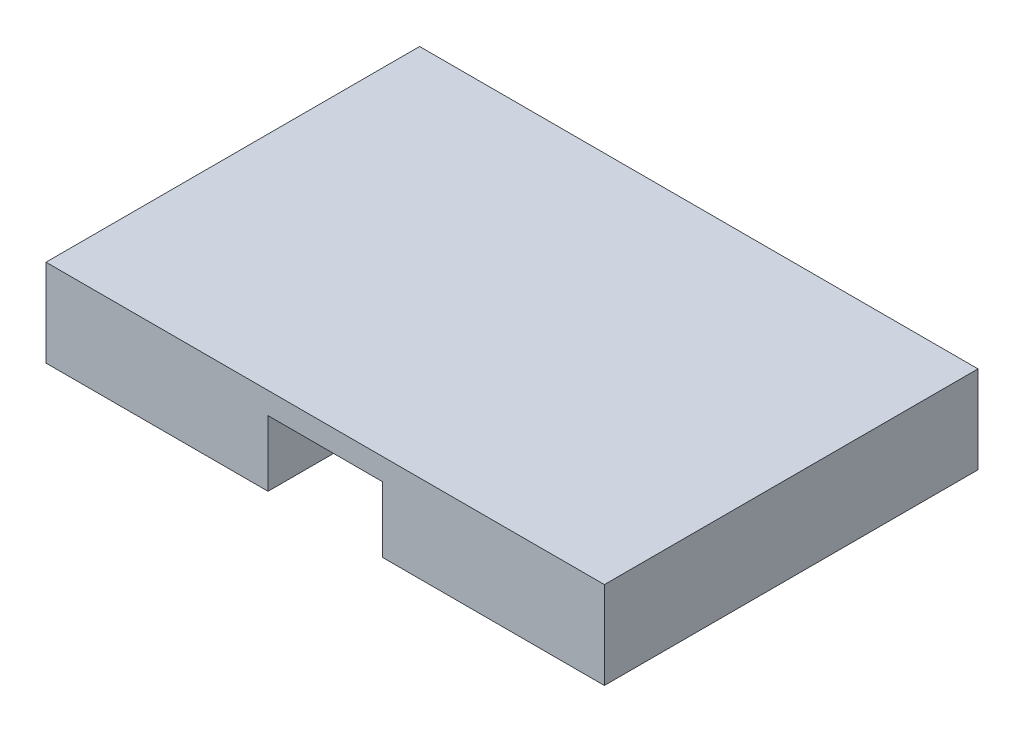
ISO-10303-21;
HEADER;
FILE_DESCRIPTION(('STEP AP214'),'2;1');
FILE_NAME('part.step','',(''),(''),'','','');
FILE_SCHEMA(('AUTOMOTIVE_DESIGN { 1 0 10303 214 1 1 1 1 }'));
ENDSEC;
DATA;
#1=APPLICATION_CONTEXT('core data for automotive mechanical design processes');
#2=APPLICATION_PROTOCOL_DEFINITION('international standard','automotive_design',2000,#1);
#3=PRODUCT_CONTEXT('',#1,'mechanical');
#4=PRODUCT('Part','Part','',(#3));
#5=PRODUCT_RELATED_PRODUCT_CATEGORY('part','',(#4));
#6=PRODUCT_DEFINITION_FORMATION('','',#4);
#7=PRODUCT_DEFINITION_CONTEXT('part definition',#1,'design');
#8=PRODUCT_DEFINITION('design','',#6,#7);
#9=PRODUCT_DEFINITION_SHAPE('','',#8);
#10=(LENGTH_UNIT() NAMED_UNIT(*) SI_UNIT(.MILLI.,.METRE.));
#11=(NAMED_UNIT(*) PLANE_ANGLE_UNIT() SI_UNIT($,.RADIAN.));
#12=(NAMED_UNIT(*) SI_UNIT($,.STERADIAN.) SOLID_ANGLE_UNIT());
#13=UNCERTAINTY_MEASURE_WITH_UNIT(LENGTH_MEASURE(1.E-05),#10,'distance_accuracy_value','');
#14=(GEOMETRIC_REPRESENTATION_CONTEXT(3) GLOBAL_UNCERTAINTY_ASSIGNED_CONTEXT((#13)) GLOBAL_UNIT_ASSIGNED_CONTEXT((#10,
#11,#12)) REPRESENTATION_CONTEXT('',''));
#15=CARTESIAN_POINT('',(0.,0.,0.));
#16=DIRECTION('',(0.,0.,1.));
#17=DIRECTION('',(1.,0.,0.));
#18=AXIS2_PLACEMENT_3D('',#15,#16,#17);
#19=CARTESIAN_POINT('',(0.,0.,0.));
#20=DIRECTION('',(0.,-1.,0.));
#21=DIRECTION('',(0.,0.,-1.));
#22=AXIS2_PLACEMENT_3D('',#19,#20,#21);
#23=PLANE('',#22);
#24=DIRECTION('',(0.,0.,-1.));
#25=VECTOR('',#24,1.);
#26=CARTESIAN_POINT('',(50.8,0.,0.));
#27=LINE('',#26,#25);
#28=CARTESIAN_POINT('',(50.8,0.,0.));
#29=VERTEX_POINT('',#28);
#30=CARTESIAN_POINT('',(50.8,0.,-85.48));
#31=VERTEX_POINT('',#30);
#32=EDGE_CURVE('E11',#29,#31,#27,.T.);
#33=ORIENTED_EDGE('',*,*,#32,.F.);
#34=DIRECTION('',(1.,0.,0.));
#35=VECTOR('',#34,1.);
#36=CARTESIAN_POINT('',(0.,0.,0.));
#37=LINE('',#36,#35);
#38=CARTESIAN_POINT('',(0.,0.,0.));
#39=VERTEX_POINT('',#38);
#40=EDGE_CURVE('E148',#39,#29,#37,.T.);
#41=ORIENTED_EDGE('',*,*,#40,.F.);
#42=DIRECTION('',(0.,0.,1.));
#43=VECTOR('',#42,1.);
#44=CARTESIAN_POINT('',(0.,0.,0.));
#45=LINE('',#44,#43);
#46=CARTESIAN_POINT('',(0.,0.,-85.48));
#47=VERTEX_POINT('',#46);
#48=EDGE_CURVE('E133',#47,#39,#45,.T.);
#49=ORIENTED_EDGE('',*,*,#48,.F.);
#50=DIRECTION('',(-1.,0.,0.));
#51=VECTOR('',#50,1.);
#52=CARTESIAN_POINT('',(0.,0.,-85.48));
#53=LINE('',#52,#51);
#54=EDGE_CURVE('E80',#31,#47,#53,.T.);
#55=ORIENTED_EDGE('',*,*,#54,.F.);
#56=EDGE_LOOP('',(#33,#41,#49,#55));
#57=FACE_BOUND('',#56,.T.);
#58=ADVANCED_FACE('F35',(#57),#23,.T.);
#59=CARTESIAN_POINT('',(0.,20.,0.));
#60=DIRECTION('',(1.,0.,0.));
#61=DIRECTION('',(0.,0.,-1.));
#62=AXIS2_PLACEMENT_3D('',#59,#60,#61);
#63=PLANE('',#62);
#64=ORIENTED_EDGE('',*,*,#48,.T.);
#65=DIRECTION('',(0.,-1.,0.));
#66=VECTOR('',#65,1.);
#67=CARTESIAN_POINT('',(0.,20.,0.));
#68=LINE('',#67,#66);
#69=CARTESIAN_POINT('',(0.,20.,0.));
#70=VERTEX_POINT('',#69);
#71=EDGE_CURVE('E161',#70,#39,#68,.T.);
#72=ORIENTED_EDGE('',*,*,#71,.F.);
#73=DIRECTION('',(0.,0.,1.));
#74=VECTOR('',#73,1.);
#75=CARTESIAN_POINT('',(0.,20.,0.));
#76=LINE('',#75,#74);
#77=CARTESIAN_POINT('',(0.,20.,-85.48));
#78=VERTEX_POINT('',#77);
#79=EDGE_CURVE('E137',#78,#70,#76,.T.);
#80=ORIENTED_EDGE('',*,*,#79,.F.);
#81=DIRECTION('',(0.,-1.,0.));
#82=VECTOR('',#81,1.);
#83=CARTESIAN_POINT('',(0.,20.,-85.48));
#84=LINE('',#83,#82);
#85=EDGE_CURVE('E144',#78,#47,#84,.T.);
#86=ORIENTED_EDGE('',*,*,#85,.T.);
#87=EDGE_LOOP('',(#64,#72,#80,#86));
#88=FACE_BOUND('',#87,.T.);
#89=ADVANCED_FACE('F37',(#88),#63,.F.);
#90=CARTESIAN_POINT('',(0.,20.,0.));
#91=DIRECTION('',(0.,0.,-1.));
#92=DIRECTION('',(-1.,0.,0.));
#93=AXIS2_PLACEMENT_3D('',#90,#91,#92);
#94=PLANE('',#93);
#95=ORIENTED_EDGE('',*,*,#40,.T.);
#96=DIRECTION('',(0.,1.,0.));
#97=VECTOR('',#96,1.);
#98=CARTESIAN_POINT('',(50.8,-5.,0.));
#99=LINE('',#98,#97);
#100=CARTESIAN_POINT('',(50.8,15.,0.));
#101=VERTEX_POINT('',#100);
#102=EDGE_CURVE('E127',#29,#101,#99,.T.);
#103=ORIENTED_EDGE('',*,*,#102,.T.);
#104=DIRECTION('',(1.,0.,0.));
#105=VECTOR('',#104,1.);
#106=CARTESIAN_POINT('',(0.,15.,0.));
#107=LINE('',#106,#105);
#108=CARTESIAN_POINT('',(76.96,15.,0.));
#109=VERTEX_POINT('',#108);
#110=EDGE_CURVE('E119',#101,#109,#107,.T.);
#111=ORIENTED_EDGE('',*,*,#110,.T.);
#112=DIRECTION('',(0.,1.,0.));
#113=VECTOR('',#112,1.);
#114=CARTESIAN_POINT('',(76.96,-5.,0.));
#115=LINE('',#114,#113);
#116=CARTESIAN_POINT('',(76.96,0.,0.));
#117=VERTEX_POINT('',#116);
#118=EDGE_CURVE('E108',#117,#109,#115,.T.);
#119=ORIENTED_EDGE('',*,*,#118,.F.);
#120=CARTESIAN_POINT('',(127.76,0.,0.));
#121=VERTEX_POINT('',#120);
#122=EDGE_CURVE('E147',#117,#121,#37,.T.);
#123=ORIENTED_EDGE('',*,*,#122,.T.);
#124=DIRECTION('',(0.,-1.,0.));
#125=VECTOR('',#124,1.);
#126=CARTESIAN_POINT('',(127.76,20.,0.));
#127=LINE('',#126,#125);
#128=CARTESIAN_POINT('',(127.76,20.,0.));
#129=VERTEX_POINT('',#128);
#130=EDGE_CURVE('E158',#129,#121,#127,.T.);
#131=ORIENTED_EDGE('',*,*,#130,.F.);
#132=DIRECTION('',(1.,0.,0.));
#133=VECTOR('',#132,1.);
#134=CARTESIAN_POINT('',(0.,20.,0.));
#135=LINE('',#134,#133);
#136=EDGE_CURVE('E88',#70,#129,#135,.T.);
#137=ORIENTED_EDGE('',*,*,#136,.F.);
#138=ORIENTED_EDGE('',*,*,#71,.T.);
#139=EDGE_LOOP('',(#95,#103,#111,#119,#123,#131,#137,#138));
#140=FACE_BOUND('',#139,.T.);
#141=ADVANCED_FACE('F126',(#140),#94,.F.);
#142=CARTESIAN_POINT('',(127.76,20.,0.));
#143=DIRECTION('',(-1.,0.,0.));
#144=DIRECTION('',(0.,0.,1.));
#145=AXIS2_PLACEMENT_3D('',#142,#143,#144);
#146=PLANE('',#145);
#147=DIRECTION('',(0.,0.,-1.));
#148=VECTOR('',#147,1.);
#149=CARTESIAN_POINT('',(127.76,0.,0.));
#150=LINE('',#149,#148);
#151=CARTESIAN_POINT('',(127.76,0.,-85.48));
#152=VERTEX_POINT('',#151);
#153=EDGE_CURVE('E150',#121,#152,#150,.T.);
#154=ORIENTED_EDGE('',*,*,#153,.T.);
#155=DIRECTION('',(0.,-1.,0.));
#156=VECTOR('',#155,1.);
#157=CARTESIAN_POINT('',(127.76,20.,-85.48));
#158=LINE('',#157,#156);
#159=CARTESIAN_POINT('',(127.76,20.,-85.48));
#160=VERTEX_POINT('',#159);
#161=EDGE_CURVE('E155',#160,#152,#158,.T.);
#162=ORIENTED_EDGE('',*,*,#161,.F.);
#163=DIRECTION('',(0.,0.,-1.));
#164=VECTOR('',#163,1.);
#165=CARTESIAN_POINT('',(127.76,20.,0.));
#166=LINE('',#165,#164);
#167=EDGE_CURVE('E141',#129,#160,#166,.T.);
#168=ORIENTED_EDGE('',*,*,#167,.F.);
#169=ORIENTED_EDGE('',*,*,#130,.T.);
#170=EDGE_LOOP('',(#154,#162,#168,#169));
#171=FACE_BOUND('',#170,.T.);
#172=ADVANCED_FACE('F178',(#171),#146,.F.);
#173=CARTESIAN_POINT('',(0.,20.,-85.48));
#174=DIRECTION('',(0.,0.,1.));
#175=DIRECTION('',(1.,0.,0.));
#176=AXIS2_PLACEMENT_3D('',#173,#174,#175);
#177=PLANE('',#176);
#178=DIRECTION('',(-1.,0.,0.));
#179=VECTOR('',#178,1.);
#180=CARTESIAN_POINT('',(0.,15.,-85.48));
#181=LINE('',#180,#179);
#182=CARTESIAN_POINT('',(76.96,15.,-85.48));
#183=VERTEX_POINT('',#182);
#184=CARTESIAN_POINT('',(50.8,15.,-85.48));
#185=VERTEX_POINT('',#184);
#186=EDGE_CURVE('E122',#183,#185,#181,.T.);
#187=ORIENTED_EDGE('',*,*,#186,.T.);
#188=DIRECTION('',(0.,1.,0.));
#189=VECTOR('',#188,1.);
#190=CARTESIAN_POINT('',(50.8,-5.,-85.48));
#191=LINE('',#190,#189);
#192=EDGE_CURVE('E134',#31,#185,#191,.T.);
#193=ORIENTED_EDGE('',*,*,#192,.F.);
#194=ORIENTED_EDGE('',*,*,#54,.T.);
#195=ORIENTED_EDGE('',*,*,#85,.F.);
#196=DIRECTION('',(-1.,0.,0.));
#197=VECTOR('',#196,1.);
#198=CARTESIAN_POINT('',(0.,20.,-85.48));
#199=LINE('',#198,#197);
#200=EDGE_CURVE('E59',#160,#78,#199,.T.);
#201=ORIENTED_EDGE('',*,*,#200,.F.);
#202=ORIENTED_EDGE('',*,*,#161,.T.);
#203=CARTESIAN_POINT('',(76.96,0.,-85.48));
#204=VERTEX_POINT('',#203);
#205=EDGE_CURVE('E139',#152,#204,#53,.T.);
#206=ORIENTED_EDGE('',*,*,#205,.T.);
#207=DIRECTION('',(0.,1.,0.));
#208=VECTOR('',#207,1.);
#209=CARTESIAN_POINT('',(76.96,-5.,-85.48));
#210=LINE('',#209,#208);
#211=EDGE_CURVE('E50',#204,#183,#210,.T.);
#212=ORIENTED_EDGE('',*,*,#211,.T.);
#213=EDGE_LOOP('',(#187,#193,#194,#195,#201,#202,#206,#212));
#214=FACE_BOUND('',#213,.T.);
#215=ADVANCED_FACE('F170',(#214),#177,.F.);
#216=CARTESIAN_POINT('',(0.,20.,0.));
#217=DIRECTION('',(0.,-1.,0.));
#218=DIRECTION('',(0.,0.,-1.));
#219=AXIS2_PLACEMENT_3D('',#216,#217,#218);
#220=PLANE('',#219);
#221=ORIENTED_EDGE('',*,*,#79,.T.);
#222=ORIENTED_EDGE('',*,*,#136,.T.);
#223=ORIENTED_EDGE('',*,*,#167,.T.);
#224=ORIENTED_EDGE('',*,*,#200,.T.);
#225=EDGE_LOOP('',(#221,#222,#223,#224));
#226=FACE_BOUND('',#225,.T.);
#227=ADVANCED_FACE('F179',(#226),#220,.F.);
#228=DIRECTION('',(0.,0.,1.));
#229=VECTOR('',#228,1.);
#230=CARTESIAN_POINT('',(76.96,0.,0.));
#231=LINE('',#230,#229);
#232=EDGE_CURVE('E43',#204,#117,#231,.T.);
#233=ORIENTED_EDGE('',*,*,#232,.F.);
#234=ORIENTED_EDGE('',*,*,#205,.F.);
#235=ORIENTED_EDGE('',*,*,#153,.F.);
#236=ORIENTED_EDGE('',*,*,#122,.F.);
#237=EDGE_LOOP('',(#233,#234,#235,#236));
#238=FACE_BOUND('',#237,.T.);
#239=ADVANCED_FACE('F175',(#238),#23,.T.);
#240=CARTESIAN_POINT('',(50.8,-5.,0.));
#241=DIRECTION('',(-1.,0.,0.));
#242=DIRECTION('',(0.,0.,1.));
#243=AXIS2_PLACEMENT_3D('',#240,#241,#242);
#244=PLANE('',#243);
#245=ORIENTED_EDGE('',*,*,#32,.T.);
#246=ORIENTED_EDGE('',*,*,#192,.T.);
#247=DIRECTION('',(0.,0.,1.));
#248=VECTOR('',#247,1.);
#249=CARTESIAN_POINT('',(50.8,15.,0.));
#250=LINE('',#249,#248);
#251=EDGE_CURVE('E114',#185,#101,#250,.T.);
#252=ORIENTED_EDGE('',*,*,#251,.T.);
#253=ORIENTED_EDGE('',*,*,#102,.F.);
#254=EDGE_LOOP('',(#245,#246,#252,#253));
#255=FACE_BOUND('',#254,.T.);
#256=ADVANCED_FACE('F169',(#255),#244,.F.);
#257=CARTESIAN_POINT('',(76.96,-5.,0.));
#258=DIRECTION('',(1.,0.,0.));
#259=DIRECTION('',(0.,0.,-1.));
#260=AXIS2_PLACEMENT_3D('',#257,#258,#259);
#261=PLANE('',#260);
#262=ORIENTED_EDGE('',*,*,#232,.T.);
#263=ORIENTED_EDGE('',*,*,#118,.T.);
#264=DIRECTION('',(0.,0.,-1.));
#265=VECTOR('',#264,1.);
#266=CARTESIAN_POINT('',(76.96,15.,0.));
#267=LINE('',#266,#265);
#268=EDGE_CURVE('E111',#109,#183,#267,.T.);
#269=ORIENTED_EDGE('',*,*,#268,.T.);
#270=ORIENTED_EDGE('',*,*,#211,.F.);
#271=EDGE_LOOP('',(#262,#263,#269,#270));
#272=FACE_BOUND('',#271,.T.);
#273=ADVANCED_FACE('F110',(#272),#261,.F.);
#274=CARTESIAN_POINT('',(0.,15.,0.));
#275=DIRECTION('',(0.,1.,0.));
#276=DIRECTION('',(0.,0.,1.));
#277=AXIS2_PLACEMENT_3D('',#274,#275,#276);
#278=PLANE('',#277);
#279=ORIENTED_EDGE('',*,*,#110,.F.);
#280=ORIENTED_EDGE('',*,*,#251,.F.);
#281=ORIENTED_EDGE('',*,*,#186,.F.);
#282=ORIENTED_EDGE('',*,*,#268,.F.);
#283=EDGE_LOOP('',(#279,#280,#281,#282));
#284=FACE_BOUND('',#283,.T.);
#285=ADVANCED_FACE('F117',(#284),#278,.F.);
#286=CLOSED_SHELL('',(#58,#89,#141,#172,#215,#227,#239,#256,#273,#285));
#287=MANIFOLD_SOLID_BREP('B2',#286);
#288=ADVANCED_BREP_SHAPE_REPRESENTATION('',(#18,#287),#14);
#289=SHAPE_DEFINITION_REPRESENTATION(#9,#288);
ENDSEC;
END-ISO-10303-21;
